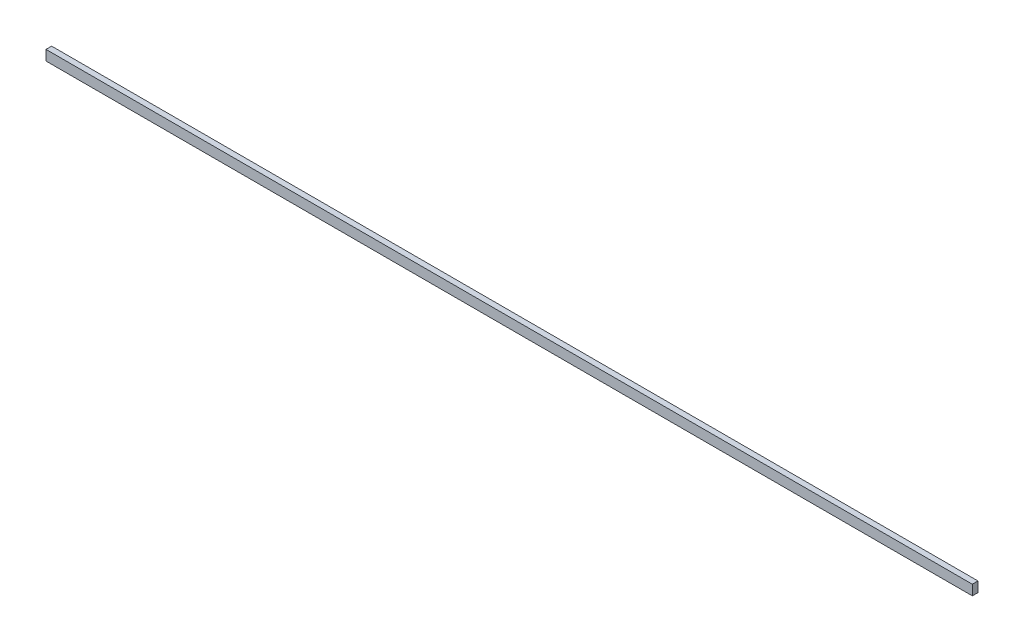
ISO-10303-21;
HEADER;
FILE_DESCRIPTION(('STEP AP214'),'2;1');
FILE_NAME('part.step','',(''),(''),'','','');
FILE_SCHEMA(('AUTOMOTIVE_DESIGN { 1 0 10303 214 1 1 1 1 }'));
ENDSEC;
DATA;
#1=APPLICATION_CONTEXT('core data for automotive mechanical design processes');
#2=APPLICATION_PROTOCOL_DEFINITION('international standard','automotive_design',2000,#1);
#3=PRODUCT_CONTEXT('',#1,'mechanical');
#4=PRODUCT('Part','Part','',(#3));
#5=PRODUCT_RELATED_PRODUCT_CATEGORY('part','',(#4));
#6=PRODUCT_DEFINITION_FORMATION('','',#4);
#7=PRODUCT_DEFINITION_CONTEXT('part definition',#1,'design');
#8=PRODUCT_DEFINITION('design','',#6,#7);
#9=PRODUCT_DEFINITION_SHAPE('','',#8);
#10=(LENGTH_UNIT() NAMED_UNIT(*) SI_UNIT(.MILLI.,.METRE.));
#11=(NAMED_UNIT(*) PLANE_ANGLE_UNIT() SI_UNIT($,.RADIAN.));
#12=(NAMED_UNIT(*) SI_UNIT($,.STERADIAN.) SOLID_ANGLE_UNIT());
#13=UNCERTAINTY_MEASURE_WITH_UNIT(LENGTH_MEASURE(1.E-05),#10,'distance_accuracy_value','');
#14=(GEOMETRIC_REPRESENTATION_CONTEXT(3) GLOBAL_UNCERTAINTY_ASSIGNED_CONTEXT((#13)) GLOBAL_UNIT_ASSIGNED_CONTEXT((#10,
#11,#12)) REPRESENTATION_CONTEXT('',''));
#15=CARTESIAN_POINT('',(0.,0.,0.));
#16=DIRECTION('',(0.,0.,1.));
#17=DIRECTION('',(1.,0.,0.));
#18=AXIS2_PLACEMENT_3D('',#15,#16,#17);
#19=CARTESIAN_POINT('',(229.2,-2.50000000000008,1.4));
#20=DIRECTION('',(-1.,0.,0.));
#21=DIRECTION('',(0.,0.,1.));
#22=AXIS2_PLACEMENT_3D('',#19,#20,#21);
#23=PLANE('',#22);
#24=DIRECTION('',(0.,1.,0.));
#25=VECTOR('',#24,1.);
#26=CARTESIAN_POINT('',(229.2,-2.50000000000008,-1.4));
#27=LINE('',#26,#25);
#28=CARTESIAN_POINT('',(229.2,-2.50000000000008,-1.4));
#29=VERTEX_POINT('',#28);
#30=CARTESIAN_POINT('',(229.2,2.50000000000008,-1.4));
#31=VERTEX_POINT('',#30);
#32=EDGE_CURVE('E96',#29,#31,#27,.T.);
#33=ORIENTED_EDGE('',*,*,#32,.T.);
#34=DIRECTION('',(0.,0.,-1.));
#35=VECTOR('',#34,1.);
#36=CARTESIAN_POINT('',(229.2,2.50000000000008,1.4));
#37=LINE('',#36,#35);
#38=CARTESIAN_POINT('',(229.2,2.50000000000008,1.4));
#39=VERTEX_POINT('',#38);
#40=EDGE_CURVE('E11',#39,#31,#37,.T.);
#41=ORIENTED_EDGE('',*,*,#40,.F.);
#42=DIRECTION('',(0.,1.,0.));
#43=VECTOR('',#42,1.);
#44=CARTESIAN_POINT('',(229.2,-2.50000000000008,1.4));
#45=LINE('',#44,#43);
#46=CARTESIAN_POINT('',(229.2,-2.50000000000008,1.4));
#47=VERTEX_POINT('',#46);
#48=EDGE_CURVE('E84',#47,#39,#45,.T.);
#49=ORIENTED_EDGE('',*,*,#48,.F.);
#50=DIRECTION('',(0.,0.,-1.));
#51=VECTOR('',#50,1.);
#52=CARTESIAN_POINT('',(229.2,-2.50000000000008,1.4));
#53=LINE('',#52,#51);
#54=EDGE_CURVE('E92',#47,#29,#53,.T.);
#55=ORIENTED_EDGE('',*,*,#54,.T.);
#56=EDGE_LOOP('',(#33,#41,#49,#55));
#57=FACE_BOUND('',#56,.T.);
#58=ADVANCED_FACE('F33',(#57),#23,.F.);
#59=CARTESIAN_POINT('',(-229.2,2.49999999999992,1.4));
#60=DIRECTION('',(0.,-1.,0.));
#61=DIRECTION('',(1.,0.,0.));
#62=AXIS2_PLACEMENT_3D('',#59,#60,#61);
#63=PLANE('',#62);
#64=DIRECTION('',(-1.,0.,0.));
#65=VECTOR('',#64,1.);
#66=CARTESIAN_POINT('',(-229.2,2.49999999999992,-1.4));
#67=LINE('',#66,#65);
#68=CARTESIAN_POINT('',(-229.2,2.49999999999992,-1.4));
#69=VERTEX_POINT('',#68);
#70=EDGE_CURVE('E88',#31,#69,#67,.T.);
#71=ORIENTED_EDGE('',*,*,#70,.T.);
#72=DIRECTION('',(0.,0.,-1.));
#73=VECTOR('',#72,1.);
#74=CARTESIAN_POINT('',(-229.2,2.49999999999992,1.4));
#75=LINE('',#74,#73);
#76=CARTESIAN_POINT('',(-229.2,2.49999999999992,1.4));
#77=VERTEX_POINT('',#76);
#78=EDGE_CURVE('E41',#77,#69,#75,.T.);
#79=ORIENTED_EDGE('',*,*,#78,.F.);
#80=DIRECTION('',(-1.,0.,0.));
#81=VECTOR('',#80,1.);
#82=CARTESIAN_POINT('',(-229.2,2.49999999999992,1.4));
#83=LINE('',#82,#81);
#84=EDGE_CURVE('E79',#39,#77,#83,.T.);
#85=ORIENTED_EDGE('',*,*,#84,.F.);
#86=ORIENTED_EDGE('',*,*,#40,.T.);
#87=EDGE_LOOP('',(#71,#79,#85,#86));
#88=FACE_BOUND('',#87,.T.);
#89=ADVANCED_FACE('F87',(#88),#63,.F.);
#90=CARTESIAN_POINT('',(-229.2,-2.50000000000008,1.4));
#91=DIRECTION('',(1.,0.,0.));
#92=DIRECTION('',(0.,0.,-1.));
#93=AXIS2_PLACEMENT_3D('',#90,#91,#92);
#94=PLANE('',#93);
#95=DIRECTION('',(0.,-1.,0.));
#96=VECTOR('',#95,1.);
#97=CARTESIAN_POINT('',(-229.2,-2.50000000000008,-1.4));
#98=LINE('',#97,#96);
#99=CARTESIAN_POINT('',(-229.2,-2.50000000000008,-1.4));
#100=VERTEX_POINT('',#99);
#101=EDGE_CURVE('E66',#69,#100,#98,.T.);
#102=ORIENTED_EDGE('',*,*,#101,.T.);
#103=DIRECTION('',(0.,0.,-1.));
#104=VECTOR('',#103,1.);
#105=CARTESIAN_POINT('',(-229.2,-2.50000000000008,1.4));
#106=LINE('',#105,#104);
#107=CARTESIAN_POINT('',(-229.2,-2.50000000000008,1.4));
#108=VERTEX_POINT('',#107);
#109=EDGE_CURVE('E89',#108,#100,#106,.T.);
#110=ORIENTED_EDGE('',*,*,#109,.F.);
#111=DIRECTION('',(0.,-1.,0.));
#112=VECTOR('',#111,1.);
#113=CARTESIAN_POINT('',(-229.2,-2.50000000000008,1.4));
#114=LINE('',#113,#112);
#115=EDGE_CURVE('E82',#77,#108,#114,.T.);
#116=ORIENTED_EDGE('',*,*,#115,.F.);
#117=ORIENTED_EDGE('',*,*,#78,.T.);
#118=EDGE_LOOP('',(#102,#110,#116,#117));
#119=FACE_BOUND('',#118,.T.);
#120=ADVANCED_FACE('F90',(#119),#94,.F.);
#121=CARTESIAN_POINT('',(-229.2,-2.50000000000008,1.4));
#122=DIRECTION('',(0.,1.,0.));
#123=DIRECTION('',(0.,0.,1.));
#124=AXIS2_PLACEMENT_3D('',#121,#122,#123);
#125=PLANE('',#124);
#126=DIRECTION('',(1.,0.,0.));
#127=VECTOR('',#126,1.);
#128=CARTESIAN_POINT('',(-229.2,-2.50000000000008,-1.4));
#129=LINE('',#128,#127);
#130=EDGE_CURVE('E72',#100,#29,#129,.T.);
#131=ORIENTED_EDGE('',*,*,#130,.T.);
#132=ORIENTED_EDGE('',*,*,#54,.F.);
#133=DIRECTION('',(1.,0.,0.));
#134=VECTOR('',#133,1.);
#135=CARTESIAN_POINT('',(-229.2,-2.50000000000008,1.4));
#136=LINE('',#135,#134);
#137=EDGE_CURVE('E49',#108,#47,#136,.T.);
#138=ORIENTED_EDGE('',*,*,#137,.F.);
#139=ORIENTED_EDGE('',*,*,#109,.T.);
#140=EDGE_LOOP('',(#131,#132,#138,#139));
#141=FACE_BOUND('',#140,.T.);
#142=ADVANCED_FACE('F103',(#141),#125,.F.);
#143=CARTESIAN_POINT('',(0.,0.,1.4));
#144=DIRECTION('',(0.,0.,-1.));
#145=DIRECTION('',(-1.,0.,0.));
#146=AXIS2_PLACEMENT_3D('',#143,#144,#145);
#147=PLANE('',#146);
#148=ORIENTED_EDGE('',*,*,#48,.T.);
#149=ORIENTED_EDGE('',*,*,#84,.T.);
#150=ORIENTED_EDGE('',*,*,#115,.T.);
#151=ORIENTED_EDGE('',*,*,#137,.T.);
#152=EDGE_LOOP('',(#148,#149,#150,#151));
#153=FACE_BOUND('',#152,.T.);
#154=ADVANCED_FACE('F80',(#153),#147,.F.);
#155=CARTESIAN_POINT('',(0.,0.,-1.4));
#156=DIRECTION('',(0.,0.,-1.));
#157=DIRECTION('',(-1.,0.,0.));
#158=AXIS2_PLACEMENT_3D('',#155,#156,#157);
#159=PLANE('',#158);
#160=ORIENTED_EDGE('',*,*,#32,.F.);
#161=ORIENTED_EDGE('',*,*,#130,.F.);
#162=ORIENTED_EDGE('',*,*,#101,.F.);
#163=ORIENTED_EDGE('',*,*,#70,.F.);
#164=EDGE_LOOP('',(#160,#161,#162,#163));
#165=FACE_BOUND('',#164,.T.);
#166=ADVANCED_FACE('F106',(#165),#159,.T.);
#167=CLOSED_SHELL('',(#58,#89,#120,#142,#154,#166));
#168=MANIFOLD_SOLID_BREP('B2',#167);
#169=ADVANCED_BREP_SHAPE_REPRESENTATION('',(#18,#168),#14);
#170=SHAPE_DEFINITION_REPRESENTATION(#9,#169);
ENDSEC;
END-ISO-10303-21;
